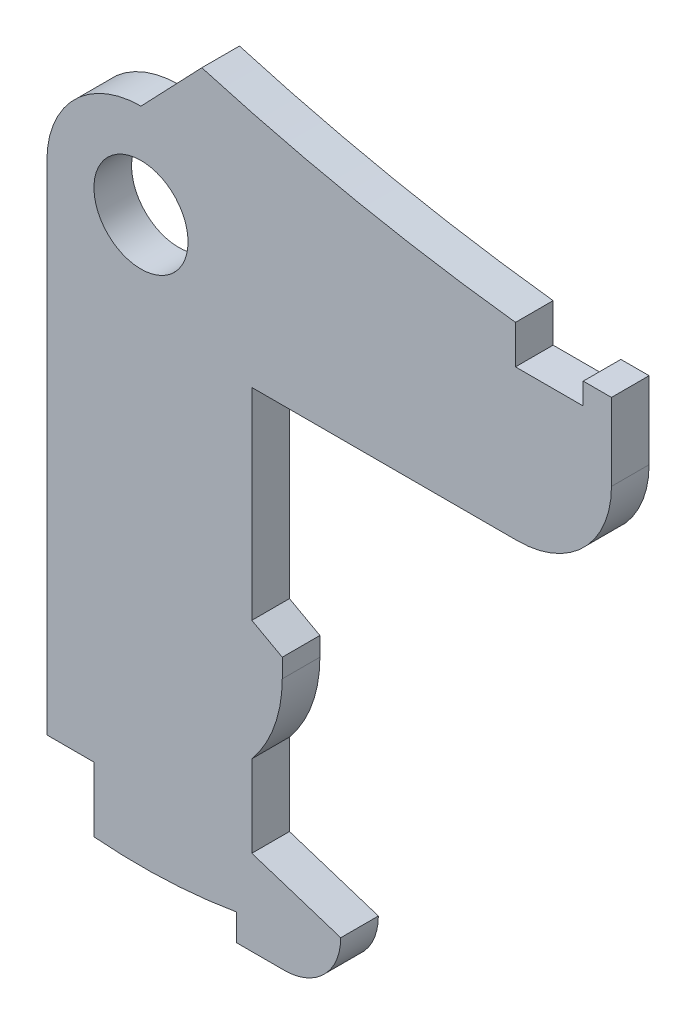
ISO-10303-21;
HEADER;
FILE_DESCRIPTION(('STEP AP214'),'2;1');
FILE_NAME('part.step','',(''),(''),'','','');
FILE_SCHEMA(('AUTOMOTIVE_DESIGN { 1 0 10303 214 1 1 1 1 }'));
ENDSEC;
DATA;
#1=APPLICATION_CONTEXT('core data for automotive mechanical design processes');
#2=APPLICATION_PROTOCOL_DEFINITION('international standard','automotive_design',2000,#1);
#3=PRODUCT_CONTEXT('',#1,'mechanical');
#4=PRODUCT('Part','Part','',(#3));
#5=PRODUCT_RELATED_PRODUCT_CATEGORY('part','',(#4));
#6=PRODUCT_DEFINITION_FORMATION('','',#4);
#7=PRODUCT_DEFINITION_CONTEXT('part definition',#1,'design');
#8=PRODUCT_DEFINITION('design','',#6,#7);
#9=PRODUCT_DEFINITION_SHAPE('','',#8);
#10=(LENGTH_UNIT() NAMED_UNIT(*) SI_UNIT(.MILLI.,.METRE.));
#11=(NAMED_UNIT(*) PLANE_ANGLE_UNIT() SI_UNIT($,.RADIAN.));
#12=(NAMED_UNIT(*) SI_UNIT($,.STERADIAN.) SOLID_ANGLE_UNIT());
#13=UNCERTAINTY_MEASURE_WITH_UNIT(LENGTH_MEASURE(1.E-05),#10,'distance_accuracy_value','');
#14=(GEOMETRIC_REPRESENTATION_CONTEXT(3) GLOBAL_UNCERTAINTY_ASSIGNED_CONTEXT((#13)) GLOBAL_UNIT_ASSIGNED_CONTEXT((#10,
#11,#12)) REPRESENTATION_CONTEXT('',''));
#15=CARTESIAN_POINT('',(0.,0.,0.));
#16=DIRECTION('',(0.,0.,1.));
#17=DIRECTION('',(1.,0.,0.));
#18=AXIS2_PLACEMENT_3D('',#15,#16,#17);
#19=CARTESIAN_POINT('',(0.,-69.1109493092821,2.));
#20=DIRECTION('',(0.,1.,0.));
#21=DIRECTION('',(0.,0.,1.));
#22=AXIS2_PLACEMENT_3D('',#19,#20,#21);
#23=PLANE('',#22);
#24=DIRECTION('',(1.,0.,0.));
#25=VECTOR('',#24,1.);
#26=CARTESIAN_POINT('',(0.,-69.1109493092821,0.));
#27=LINE('',#26,#25);
#28=CARTESIAN_POINT('',(58.5628566486414,-69.1109493092821,0.));
#29=VERTEX_POINT('',#28);
#30=CARTESIAN_POINT('',(61.1004317090133,-69.1109493092821,0.));
#31=VERTEX_POINT('',#30);
#32=EDGE_CURVE('E226',#29,#31,#27,.T.);
#33=ORIENTED_EDGE('',*,*,#32,.T.);
#34=DIRECTION('',(0.,0.,-1.));
#35=VECTOR('',#34,1.);
#36=CARTESIAN_POINT('',(61.1004317090133,-69.1109493092821,2.));
#37=LINE('',#36,#35);
#38=CARTESIAN_POINT('',(61.1004317090133,-69.1109493092821,2.));
#39=VERTEX_POINT('',#38);
#40=EDGE_CURVE('E11',#39,#31,#37,.T.);
#41=ORIENTED_EDGE('',*,*,#40,.F.);
#42=DIRECTION('',(1.,0.,0.));
#43=VECTOR('',#42,1.);
#44=CARTESIAN_POINT('',(0.,-69.1109493092821,2.));
#45=LINE('',#44,#43);
#46=CARTESIAN_POINT('',(58.5628566486414,-69.1109493092821,2.));
#47=VERTEX_POINT('',#46);
#48=EDGE_CURVE('E398',#47,#39,#45,.T.);
#49=ORIENTED_EDGE('',*,*,#48,.F.);
#50=DIRECTION('',(0.,0.,-1.));
#51=VECTOR('',#50,1.);
#52=CARTESIAN_POINT('',(58.5628566486414,-69.1109493092821,2.));
#53=LINE('',#52,#51);
#54=EDGE_CURVE('E222',#47,#29,#53,.T.);
#55=ORIENTED_EDGE('',*,*,#54,.T.);
#56=EDGE_LOOP('',(#33,#41,#49,#55));
#57=FACE_BOUND('',#56,.T.);
#58=ADVANCED_FACE('F34',(#57),#23,.F.);
#59=CARTESIAN_POINT('',(61.1004317090133,-66.1109493092821,2.));
#60=DIRECTION('',(0.,0.,-1.));
#61=DIRECTION('',(-1.,0.,0.));
#62=AXIS2_PLACEMENT_3D('',#59,#60,#61);
#63=CYLINDRICAL_SURFACE('',#62,3.00000000000001);
#64=CARTESIAN_POINT('',(61.1004317090133,-66.1109493092821,0.));
#65=DIRECTION('',(0.,0.,1.));
#66=DIRECTION('',(1.,0.,0.));
#67=AXIS2_PLACEMENT_3D('',#64,#65,#66);
#68=CIRCLE('',#67,3.00000000000001);
#69=CARTESIAN_POINT('',(64.1004317090133,-66.1109493092821,0.));
#70=VERTEX_POINT('',#69);
#71=EDGE_CURVE('E229',#31,#70,#68,.T.);
#72=ORIENTED_EDGE('',*,*,#71,.T.);
#73=DIRECTION('',(0.,0.,-1.));
#74=VECTOR('',#73,1.);
#75=CARTESIAN_POINT('',(64.1004317090133,-66.1109493092821,2.));
#76=LINE('',#75,#74);
#77=CARTESIAN_POINT('',(64.1004317090133,-66.1109493092821,2.));
#78=VERTEX_POINT('',#77);
#79=EDGE_CURVE('E43',#78,#70,#76,.T.);
#80=ORIENTED_EDGE('',*,*,#79,.F.);
#81=CARTESIAN_POINT('',(61.1004317090133,-66.1109493092821,2.));
#82=DIRECTION('',(0.,0.,1.));
#83=DIRECTION('',(1.,0.,0.));
#84=AXIS2_PLACEMENT_3D('',#81,#82,#83);
#85=CIRCLE('',#84,3.00000000000001);
#86=EDGE_CURVE('E138',#39,#78,#85,.T.);
#87=ORIENTED_EDGE('',*,*,#86,.F.);
#88=ORIENTED_EDGE('',*,*,#40,.T.);
#89=EDGE_LOOP('',(#72,#80,#87,#88));
#90=FACE_BOUND('',#89,.T.);
#91=ADVANCED_FACE('F412',(#90),#63,.T.);
#92=CARTESIAN_POINT('',(-13.2752413972475,-41.1476724947514,2.));
#93=DIRECTION('',(-0.307040459564451,-0.951696462213899,0.));
#94=DIRECTION('',(0.951696462213899,-0.307040459564451,0.));
#95=AXIS2_PLACEMENT_3D('',#92,#93,#94);
#96=PLANE('',#95);
#97=DIRECTION('',(-0.951696462213899,0.307040459564451,0.));
#98=VECTOR('',#97,1.);
#99=CARTESIAN_POINT('',(-13.2752413972475,-41.1476724947514,0.));
#100=LINE('',#99,#98);
#101=CARTESIAN_POINT('',(59.3761202637687,-64.5867713650885,0.));
#102=VERTEX_POINT('',#101);
#103=EDGE_CURVE('E231',#70,#102,#100,.T.);
#104=ORIENTED_EDGE('',*,*,#103,.T.);
#105=DIRECTION('',(0.,0.,-1.));
#106=VECTOR('',#105,1.);
#107=CARTESIAN_POINT('',(59.3761202637687,-64.5867713650885,2.));
#108=LINE('',#107,#106);
#109=CARTESIAN_POINT('',(59.3761202637687,-64.5867713650885,2.));
#110=VERTEX_POINT('',#109);
#111=EDGE_CURVE('E324',#110,#102,#108,.T.);
#112=ORIENTED_EDGE('',*,*,#111,.F.);
#113=DIRECTION('',(-0.951696462213899,0.307040459564451,0.));
#114=VECTOR('',#113,1.);
#115=CARTESIAN_POINT('',(-13.2752413972475,-41.1476724947514,2.));
#116=LINE('',#115,#114);
#117=EDGE_CURVE('E331',#78,#110,#116,.T.);
#118=ORIENTED_EDGE('',*,*,#117,.F.);
#119=ORIENTED_EDGE('',*,*,#79,.T.);
#120=EDGE_LOOP('',(#104,#112,#118,#119));
#121=FACE_BOUND('',#120,.T.);
#122=ADVANCED_FACE('F329',(#121),#96,.F.);
#123=CARTESIAN_POINT('',(59.3761202637687,0.,2.));
#124=DIRECTION('',(1.,0.,0.));
#125=DIRECTION('',(0.,0.,-1.));
#126=AXIS2_PLACEMENT_3D('',#123,#124,#125);
#127=PLANE('',#126);
#128=DIRECTION('',(0.,-1.,0.));
#129=VECTOR('',#128,1.);
#130=CARTESIAN_POINT('',(59.3761202637687,0.,0.));
#131=LINE('',#130,#129);
#132=CARTESIAN_POINT('',(59.3761202637687,-60.2400285328767,0.));
#133=VERTEX_POINT('',#132);
#134=EDGE_CURVE('E234',#133,#102,#131,.T.);
#135=ORIENTED_EDGE('',*,*,#134,.F.);
#136=DIRECTION('',(0.,0.,-1.));
#137=VECTOR('',#136,1.);
#138=CARTESIAN_POINT('',(59.3761202637687,-60.2400285328767,2.));
#139=LINE('',#138,#137);
#140=CARTESIAN_POINT('',(59.3761202637687,-60.2400285328767,2.));
#141=VERTEX_POINT('',#140);
#142=EDGE_CURVE('E322',#141,#133,#139,.T.);
#143=ORIENTED_EDGE('',*,*,#142,.F.);
#144=DIRECTION('',(0.,-1.,0.));
#145=VECTOR('',#144,1.);
#146=CARTESIAN_POINT('',(59.3761202637687,0.,2.));
#147=LINE('',#146,#145);
#148=EDGE_CURVE('E342',#141,#110,#147,.T.);
#149=ORIENTED_EDGE('',*,*,#148,.T.);
#150=ORIENTED_EDGE('',*,*,#111,.T.);
#151=EDGE_LOOP('',(#135,#143,#149,#150));
#152=FACE_BOUND('',#151,.T.);
#153=ADVANCED_FACE('F339',(#152),#127,.T.);
#154=CARTESIAN_POINT('',(53.95842090491,-55.7530720627505,2.));
#155=DIRECTION('',(0.,0.,-1.));
#156=DIRECTION('',(-1.,0.,0.));
#157=AXIS2_PLACEMENT_3D('',#154,#155,#156);
#158=CYLINDRICAL_SURFACE('',#157,7.03450387076339);
#159=CARTESIAN_POINT('',(53.95842090491,-55.7530720627505,0.));
#160=DIRECTION('',(0.,0.,1.));
#161=DIRECTION('',(1.,0.,0.));
#162=AXIS2_PLACEMENT_3D('',#159,#160,#161);
#163=CIRCLE('',#162,7.03450387076339);
#164=CARTESIAN_POINT('',(60.9929247756734,-55.7530720627505,0.));
#165=VERTEX_POINT('',#164);
#166=EDGE_CURVE('E237',#165,#133,#163,.F.);
#167=ORIENTED_EDGE('',*,*,#166,.F.);
#168=DIRECTION('',(0.,0.,-1.));
#169=VECTOR('',#168,1.);
#170=CARTESIAN_POINT('',(60.9929247756734,-55.7530720627505,2.));
#171=LINE('',#170,#169);
#172=CARTESIAN_POINT('',(60.9929247756734,-55.7530720627505,2.));
#173=VERTEX_POINT('',#172);
#174=EDGE_CURVE('E320',#173,#165,#171,.T.);
#175=ORIENTED_EDGE('',*,*,#174,.F.);
#176=CARTESIAN_POINT('',(53.95842090491,-55.7530720627505,2.));
#177=DIRECTION('',(0.,0.,1.));
#178=DIRECTION('',(1.,0.,0.));
#179=AXIS2_PLACEMENT_3D('',#176,#177,#178);
#180=CIRCLE('',#179,7.03450387076339);
#181=EDGE_CURVE('E345',#173,#141,#180,.F.);
#182=ORIENTED_EDGE('',*,*,#181,.T.);
#183=ORIENTED_EDGE('',*,*,#142,.T.);
#184=EDGE_LOOP('',(#167,#175,#182,#183));
#185=FACE_BOUND('',#184,.T.);
#186=ADVANCED_FACE('F422',(#185),#158,.T.);
#187=CARTESIAN_POINT('',(60.9929247756734,0.,2.));
#188=DIRECTION('',(-1.,0.,0.));
#189=DIRECTION('',(0.,0.,1.));
#190=AXIS2_PLACEMENT_3D('',#187,#188,#189);
#191=PLANE('',#190);
#192=DIRECTION('',(0.,1.,0.));
#193=VECTOR('',#192,1.);
#194=CARTESIAN_POINT('',(60.9929247756734,0.,0.));
#195=LINE('',#194,#193);
#196=CARTESIAN_POINT('',(60.9929247756734,-54.7553142853299,0.));
#197=VERTEX_POINT('',#196);
#198=EDGE_CURVE('E240',#165,#197,#195,.T.);
#199=ORIENTED_EDGE('',*,*,#198,.T.);
#200=DIRECTION('',(0.,0.,-1.));
#201=VECTOR('',#200,1.);
#202=CARTESIAN_POINT('',(60.9929247756734,-54.7553142853299,2.));
#203=LINE('',#202,#201);
#204=CARTESIAN_POINT('',(60.9929247756734,-54.7553142853299,2.));
#205=VERTEX_POINT('',#204);
#206=EDGE_CURVE('E317',#205,#197,#203,.T.);
#207=ORIENTED_EDGE('',*,*,#206,.F.);
#208=DIRECTION('',(0.,1.,0.));
#209=VECTOR('',#208,1.);
#210=CARTESIAN_POINT('',(60.9929247756734,0.,2.));
#211=LINE('',#210,#209);
#212=EDGE_CURVE('E347',#173,#205,#211,.T.);
#213=ORIENTED_EDGE('',*,*,#212,.F.);
#214=ORIENTED_EDGE('',*,*,#174,.T.);
#215=EDGE_LOOP('',(#199,#207,#213,#214));
#216=FACE_BOUND('',#215,.T.);
#217=ADVANCED_FACE('F425',(#216),#191,.F.);
#218=CARTESIAN_POINT('',(-8.97597044556049,-16.3550723728844,2.));
#219=DIRECTION('',(-0.481123509234274,-0.876652821168162,0.));
#220=DIRECTION('',(0.876652821168162,-0.481123509234274,0.));
#221=AXIS2_PLACEMENT_3D('',#218,#219,#220);
#222=PLANE('',#221);
#223=DIRECTION('',(-0.876652821168162,0.481123509234274,0.));
#224=VECTOR('',#223,1.);
#225=CARTESIAN_POINT('',(-8.97597044556049,-16.3550723728844,0.));
#226=LINE('',#225,#224);
#227=CARTESIAN_POINT('',(59.3761202637687,-53.8679816472202,0.));
#228=VERTEX_POINT('',#227);
#229=EDGE_CURVE('E242',#197,#228,#226,.T.);
#230=ORIENTED_EDGE('',*,*,#229,.T.);
#231=DIRECTION('',(0.,0.,-1.));
#232=VECTOR('',#231,1.);
#233=CARTESIAN_POINT('',(59.3761202637687,-53.8679816472202,2.));
#234=LINE('',#233,#232);
#235=CARTESIAN_POINT('',(59.3761202637687,-53.8679816472202,2.));
#236=VERTEX_POINT('',#235);
#237=EDGE_CURVE('E315',#236,#228,#234,.T.);
#238=ORIENTED_EDGE('',*,*,#237,.F.);
#239=DIRECTION('',(-0.876652821168162,0.481123509234274,0.));
#240=VECTOR('',#239,1.);
#241=CARTESIAN_POINT('',(-8.97597044556049,-16.3550723728844,2.));
#242=LINE('',#241,#240);
#243=EDGE_CURVE('E353',#205,#236,#242,.T.);
#244=ORIENTED_EDGE('',*,*,#243,.F.);
#245=ORIENTED_EDGE('',*,*,#206,.T.);
#246=EDGE_LOOP('',(#230,#238,#244,#245));
#247=FACE_BOUND('',#246,.T.);
#248=ADVANCED_FACE('F429',(#247),#222,.F.);
#249=CARTESIAN_POINT('',(59.3761202637687,0.,2.));
#250=DIRECTION('',(1.,0.,0.));
#251=DIRECTION('',(0.,0.,-1.));
#252=AXIS2_PLACEMENT_3D('',#249,#250,#251);
#253=PLANE('',#252);
#254=DIRECTION('',(0.,-1.,0.));
#255=VECTOR('',#254,1.);
#256=CARTESIAN_POINT('',(59.3761202637687,0.,0.));
#257=LINE('',#256,#255);
#258=CARTESIAN_POINT('',(59.3761202637687,-43.149191929352,0.));
#259=VERTEX_POINT('',#258);
#260=EDGE_CURVE('E245',#259,#228,#257,.T.);
#261=ORIENTED_EDGE('',*,*,#260,.F.);
#262=DIRECTION('',(0.,0.,-1.));
#263=VECTOR('',#262,1.);
#264=CARTESIAN_POINT('',(59.3761202637687,-43.149191929352,2.));
#265=LINE('',#264,#263);
#266=CARTESIAN_POINT('',(59.3761202637687,-43.149191929352,2.));
#267=VERTEX_POINT('',#266);
#268=EDGE_CURVE('E313',#267,#259,#265,.T.);
#269=ORIENTED_EDGE('',*,*,#268,.F.);
#270=DIRECTION('',(0.,-1.,0.));
#271=VECTOR('',#270,1.);
#272=CARTESIAN_POINT('',(59.3761202637687,0.,2.));
#273=LINE('',#272,#271);
#274=EDGE_CURVE('E355',#267,#236,#273,.T.);
#275=ORIENTED_EDGE('',*,*,#274,.T.);
#276=ORIENTED_EDGE('',*,*,#237,.T.);
#277=EDGE_LOOP('',(#261,#269,#275,#276));
#278=FACE_BOUND('',#277,.T.);
#279=ADVANCED_FACE('F433',(#278),#253,.T.);
#280=CARTESIAN_POINT('',(0.,-43.149191929352,2.));
#281=DIRECTION('',(0.,-1.,0.));
#282=DIRECTION('',(0.,0.,-1.));
#283=AXIS2_PLACEMENT_3D('',#280,#281,#282);
#284=PLANE('',#283);
#285=DIRECTION('',(-1.,0.,0.));
#286=VECTOR('',#285,1.);
#287=CARTESIAN_POINT('',(0.,-43.149191929352,0.));
#288=LINE('',#287,#286);
#289=CARTESIAN_POINT('',(73.4867153231227,-43.149191929352,0.));
#290=VERTEX_POINT('',#289);
#291=EDGE_CURVE('E248',#290,#259,#288,.T.);
#292=ORIENTED_EDGE('',*,*,#291,.F.);
#293=DIRECTION('',(0.,0.,-1.));
#294=VECTOR('',#293,1.);
#295=CARTESIAN_POINT('',(73.4867153231227,-43.149191929352,2.));
#296=LINE('',#295,#294);
#297=CARTESIAN_POINT('',(73.4867153231227,-43.149191929352,2.));
#298=VERTEX_POINT('',#297);
#299=EDGE_CURVE('E311',#298,#290,#296,.T.);
#300=ORIENTED_EDGE('',*,*,#299,.F.);
#301=DIRECTION('',(-1.,0.,0.));
#302=VECTOR('',#301,1.);
#303=CARTESIAN_POINT('',(0.,-43.149191929352,2.));
#304=LINE('',#303,#302);
#305=EDGE_CURVE('E358',#298,#267,#304,.T.);
#306=ORIENTED_EDGE('',*,*,#305,.T.);
#307=ORIENTED_EDGE('',*,*,#268,.T.);
#308=EDGE_LOOP('',(#292,#300,#306,#307));
#309=FACE_BOUND('',#308,.T.);
#310=ADVANCED_FACE('F437',(#309),#284,.T.);
#311=CARTESIAN_POINT('',(73.4867153231227,-38.149191929352,2.));
#312=DIRECTION('',(0.,0.,-1.));
#313=DIRECTION('',(-1.,0.,0.));
#314=AXIS2_PLACEMENT_3D('',#311,#312,#313);
#315=CYLINDRICAL_SURFACE('',#314,5.);
#316=CARTESIAN_POINT('',(73.4867153231227,-38.149191929352,0.));
#317=DIRECTION('',(0.,0.,1.));
#318=DIRECTION('',(1.,0.,0.));
#319=AXIS2_PLACEMENT_3D('',#316,#317,#318);
#320=CIRCLE('',#319,5.);
#321=CARTESIAN_POINT('',(78.4867153231227,-38.149191929352,0.));
#322=VERTEX_POINT('',#321);
#323=EDGE_CURVE('E251',#322,#290,#320,.F.);
#324=ORIENTED_EDGE('',*,*,#323,.F.);
#325=DIRECTION('',(0.,0.,-1.));
#326=VECTOR('',#325,1.);
#327=CARTESIAN_POINT('',(78.4867153231227,-38.149191929352,2.));
#328=LINE('',#327,#326);
#329=CARTESIAN_POINT('',(78.4867153231227,-38.149191929352,2.));
#330=VERTEX_POINT('',#329);
#331=EDGE_CURVE('E309',#330,#322,#328,.T.);
#332=ORIENTED_EDGE('',*,*,#331,.F.);
#333=CARTESIAN_POINT('',(73.4867153231227,-38.149191929352,2.));
#334=DIRECTION('',(0.,0.,1.));
#335=DIRECTION('',(1.,0.,0.));
#336=AXIS2_PLACEMENT_3D('',#333,#334,#335);
#337=CIRCLE('',#336,5.);
#338=EDGE_CURVE('E361',#330,#298,#337,.F.);
#339=ORIENTED_EDGE('',*,*,#338,.T.);
#340=ORIENTED_EDGE('',*,*,#299,.T.);
#341=EDGE_LOOP('',(#324,#332,#339,#340));
#342=FACE_BOUND('',#341,.T.);
#343=ADVANCED_FACE('F441',(#342),#315,.T.);
#344=CARTESIAN_POINT('',(78.4867153231227,0.,2.));
#345=DIRECTION('',(1.,0.,0.));
#346=DIRECTION('',(0.,0.,-1.));
#347=AXIS2_PLACEMENT_3D('',#344,#345,#346);
#348=PLANE('',#347);
#349=DIRECTION('',(0.,-1.,0.));
#350=VECTOR('',#349,1.);
#351=CARTESIAN_POINT('',(78.4867153231227,0.,0.));
#352=LINE('',#351,#350);
#353=CARTESIAN_POINT('',(78.4867153231227,-34.0532753395048,0.));
#354=VERTEX_POINT('',#353);
#355=EDGE_CURVE('E254',#354,#322,#352,.T.);
#356=ORIENTED_EDGE('',*,*,#355,.F.);
#357=DIRECTION('',(0.,0.,-1.));
#358=VECTOR('',#357,1.);
#359=CARTESIAN_POINT('',(78.4867153231227,-34.0532753395048,2.));
#360=LINE('',#359,#358);
#361=CARTESIAN_POINT('',(78.4867153231227,-34.0532753395048,2.));
#362=VERTEX_POINT('',#361);
#363=EDGE_CURVE('E307',#362,#354,#360,.T.);
#364=ORIENTED_EDGE('',*,*,#363,.F.);
#365=DIRECTION('',(0.,-1.,0.));
#366=VECTOR('',#365,1.);
#367=CARTESIAN_POINT('',(78.4867153231227,0.,2.));
#368=LINE('',#367,#366);
#369=EDGE_CURVE('E364',#362,#330,#368,.T.);
#370=ORIENTED_EDGE('',*,*,#369,.T.);
#371=ORIENTED_EDGE('',*,*,#331,.T.);
#372=EDGE_LOOP('',(#356,#364,#370,#371));
#373=FACE_BOUND('',#372,.T.);
#374=ADVANCED_FACE('F445',(#373),#348,.T.);
#375=CARTESIAN_POINT('',(0.,-34.0532753395048,2.));
#376=DIRECTION('',(0.,1.,0.));
#377=DIRECTION('',(0.,0.,1.));
#378=AXIS2_PLACEMENT_3D('',#375,#376,#377);
#379=PLANE('',#378);
#380=DIRECTION('',(1.,0.,0.));
#381=VECTOR('',#380,1.);
#382=CARTESIAN_POINT('',(0.,-34.0532753395048,0.));
#383=LINE('',#382,#381);
#384=CARTESIAN_POINT('',(76.9867153231227,-34.0532753395048,0.));
#385=VERTEX_POINT('',#384);
#386=EDGE_CURVE('E257',#385,#354,#383,.T.);
#387=ORIENTED_EDGE('',*,*,#386,.F.);
#388=DIRECTION('',(0.,0.,-1.));
#389=VECTOR('',#388,1.);
#390=CARTESIAN_POINT('',(76.9867153231227,-34.0532753395048,2.));
#391=LINE('',#390,#389);
#392=CARTESIAN_POINT('',(76.9867153231227,-34.0532753395048,2.));
#393=VERTEX_POINT('',#392);
#394=EDGE_CURVE('E305',#393,#385,#391,.T.);
#395=ORIENTED_EDGE('',*,*,#394,.F.);
#396=DIRECTION('',(1.,0.,0.));
#397=VECTOR('',#396,1.);
#398=CARTESIAN_POINT('',(0.,-34.0532753395048,2.));
#399=LINE('',#398,#397);
#400=EDGE_CURVE('E367',#393,#362,#399,.T.);
#401=ORIENTED_EDGE('',*,*,#400,.T.);
#402=ORIENTED_EDGE('',*,*,#363,.T.);
#403=EDGE_LOOP('',(#387,#395,#401,#402));
#404=FACE_BOUND('',#403,.T.);
#405=ADVANCED_FACE('F449',(#404),#379,.T.);
#406=CARTESIAN_POINT('',(76.9867153231227,0.,2.));
#407=DIRECTION('',(-1.,0.,0.));
#408=DIRECTION('',(0.,0.,1.));
#409=AXIS2_PLACEMENT_3D('',#406,#407,#408);
#410=PLANE('',#409);
#411=DIRECTION('',(0.,1.,0.));
#412=VECTOR('',#411,1.);
#413=CARTESIAN_POINT('',(76.9867153231227,0.,0.));
#414=LINE('',#413,#412);
#415=CARTESIAN_POINT('',(76.9867153231227,-35.1984634641797,0.));
#416=VERTEX_POINT('',#415);
#417=EDGE_CURVE('E260',#416,#385,#414,.T.);
#418=ORIENTED_EDGE('',*,*,#417,.F.);
#419=DIRECTION('',(0.,0.,-1.));
#420=VECTOR('',#419,1.);
#421=CARTESIAN_POINT('',(76.9867153231227,-35.1984634641797,2.));
#422=LINE('',#421,#420);
#423=CARTESIAN_POINT('',(76.9867153231227,-35.1984634641797,2.));
#424=VERTEX_POINT('',#423);
#425=EDGE_CURVE('E303',#424,#416,#422,.T.);
#426=ORIENTED_EDGE('',*,*,#425,.F.);
#427=DIRECTION('',(0.,1.,0.));
#428=VECTOR('',#427,1.);
#429=CARTESIAN_POINT('',(76.9867153231227,0.,2.));
#430=LINE('',#429,#428);
#431=EDGE_CURVE('E370',#424,#393,#430,.T.);
#432=ORIENTED_EDGE('',*,*,#431,.T.);
#433=ORIENTED_EDGE('',*,*,#394,.T.);
#434=EDGE_LOOP('',(#418,#426,#432,#433));
#435=FACE_BOUND('',#434,.T.);
#436=ADVANCED_FACE('F453',(#435),#410,.T.);
#437=CARTESIAN_POINT('',(0.,-35.1984634641797,2.));
#438=DIRECTION('',(0.,1.,0.));
#439=DIRECTION('',(0.,0.,1.));
#440=AXIS2_PLACEMENT_3D('',#437,#438,#439);
#441=PLANE('',#440);
#442=DIRECTION('',(1.,0.,0.));
#443=VECTOR('',#442,1.);
#444=CARTESIAN_POINT('',(0.,-35.1984634641797,0.));
#445=LINE('',#444,#443);
#446=CARTESIAN_POINT('',(73.3867153231227,-35.1984634641797,0.));
#447=VERTEX_POINT('',#446);
#448=EDGE_CURVE('E263',#447,#416,#445,.T.);
#449=ORIENTED_EDGE('',*,*,#448,.F.);
#450=DIRECTION('',(0.,0.,-1.));
#451=VECTOR('',#450,1.);
#452=CARTESIAN_POINT('',(73.3867153231227,-35.1984634641797,2.));
#453=LINE('',#452,#451);
#454=CARTESIAN_POINT('',(73.3867153231227,-35.1984634641797,2.));
#455=VERTEX_POINT('',#454);
#456=EDGE_CURVE('E301',#455,#447,#453,.T.);
#457=ORIENTED_EDGE('',*,*,#456,.F.);
#458=DIRECTION('',(1.,0.,0.));
#459=VECTOR('',#458,1.);
#460=CARTESIAN_POINT('',(0.,-35.1984634641797,2.));
#461=LINE('',#460,#459);
#462=EDGE_CURVE('E373',#455,#424,#461,.T.);
#463=ORIENTED_EDGE('',*,*,#462,.T.);
#464=ORIENTED_EDGE('',*,*,#425,.T.);
#465=EDGE_LOOP('',(#449,#457,#463,#464));
#466=FACE_BOUND('',#465,.T.);
#467=ADVANCED_FACE('F457',(#466),#441,.T.);
#468=CARTESIAN_POINT('',(73.3867153231227,0.,2.));
#469=DIRECTION('',(1.,0.,0.));
#470=DIRECTION('',(0.,0.,-1.));
#471=AXIS2_PLACEMENT_3D('',#468,#469,#470);
#472=PLANE('',#471);
#473=DIRECTION('',(0.,-1.,0.));
#474=VECTOR('',#473,1.);
#475=CARTESIAN_POINT('',(73.3867153231227,0.,0.));
#476=LINE('',#475,#474);
#477=CARTESIAN_POINT('',(73.3867153231227,-33.149191929352,0.));
#478=VERTEX_POINT('',#477);
#479=EDGE_CURVE('E266',#478,#447,#476,.T.);
#480=ORIENTED_EDGE('',*,*,#479,.F.);
#481=DIRECTION('',(0.,0.,-1.));
#482=VECTOR('',#481,1.);
#483=CARTESIAN_POINT('',(73.3867153231227,-33.149191929352,2.));
#484=LINE('',#483,#482);
#485=CARTESIAN_POINT('',(73.3867153231227,-33.149191929352,2.));
#486=VERTEX_POINT('',#485);
#487=EDGE_CURVE('E299',#486,#478,#484,.T.);
#488=ORIENTED_EDGE('',*,*,#487,.F.);
#489=DIRECTION('',(0.,-1.,0.));
#490=VECTOR('',#489,1.);
#491=CARTESIAN_POINT('',(73.3867153231227,0.,2.));
#492=LINE('',#491,#490);
#493=EDGE_CURVE('E376',#486,#455,#492,.T.);
#494=ORIENTED_EDGE('',*,*,#493,.T.);
#495=ORIENTED_EDGE('',*,*,#456,.T.);
#496=EDGE_LOOP('',(#480,#488,#494,#495));
#497=FACE_BOUND('',#496,.T.);
#498=ADVANCED_FACE('F461',(#497),#472,.T.);
#499=CARTESIAN_POINT('',(85.520841075924,69.3810826330756,2.));
#500=DIRECTION('',(0.,0.,-1.));
#501=DIRECTION('',(-1.,0.,0.));
#502=AXIS2_PLACEMENT_3D('',#499,#500,#501);
#503=CYLINDRICAL_SURFACE('',#502,103.245795118405);
#504=CARTESIAN_POINT('',(85.520841075924,69.3810826330756,0.));
#505=DIRECTION('',(0.,0.,1.));
#506=DIRECTION('',(1.,0.,0.));
#507=AXIS2_PLACEMENT_3D('',#504,#505,#506);
#508=CIRCLE('',#507,103.245795118405);
#509=CARTESIAN_POINT('',(56.718627508621,-29.7659127992372,0.));
#510=VERTEX_POINT('',#509);
#511=EDGE_CURVE('E269',#478,#510,#508,.F.);
#512=ORIENTED_EDGE('',*,*,#511,.T.);
#513=DIRECTION('',(0.,0.,-1.));
#514=VECTOR('',#513,1.);
#515=CARTESIAN_POINT('',(56.718627508621,-29.7659127992372,2.));
#516=LINE('',#515,#514);
#517=CARTESIAN_POINT('',(56.718627508621,-29.7659127992372,2.));
#518=VERTEX_POINT('',#517);
#519=EDGE_CURVE('E297',#518,#510,#516,.T.);
#520=ORIENTED_EDGE('',*,*,#519,.F.);
#521=CARTESIAN_POINT('',(85.520841075924,69.3810826330756,2.));
#522=DIRECTION('',(0.,0.,1.));
#523=DIRECTION('',(1.,0.,0.));
#524=AXIS2_PLACEMENT_3D('',#521,#522,#523);
#525=CIRCLE('',#524,103.245795118405);
#526=EDGE_CURVE('E379',#486,#518,#525,.F.);
#527=ORIENTED_EDGE('',*,*,#526,.F.);
#528=ORIENTED_EDGE('',*,*,#487,.T.);
#529=EDGE_LOOP('',(#512,#520,#527,#528));
#530=FACE_BOUND('',#529,.T.);
#531=ADVANCED_FACE('F465',(#530),#503,.F.);
#532=CARTESIAN_POINT('',(44.5238341929609,-42.5318505329619,2.));
#533=DIRECTION('',(-0.723097327047915,0.690746158596745,0.));
#534=DIRECTION('',(-0.690746158596745,-0.723097327047916,0.));
#535=AXIS2_PLACEMENT_3D('',#532,#533,#534);
#536=PLANE('',#535);
#537=DIRECTION('',(0.690746158596745,0.723097327047916,0.));
#538=VECTOR('',#537,1.);
#539=CARTESIAN_POINT('',(44.5238341929609,-42.5318505329619,0.));
#540=LINE('',#539,#538);
#541=CARTESIAN_POINT('',(53.4867153231227,-33.149191929352,0.));
#542=VERTEX_POINT('',#541);
#543=EDGE_CURVE('E272',#542,#510,#540,.T.);
#544=ORIENTED_EDGE('',*,*,#543,.F.);
#545=DIRECTION('',(0.,0.,-1.));
#546=VECTOR('',#545,1.);
#547=CARTESIAN_POINT('',(53.4867153231227,-33.149191929352,2.));
#548=LINE('',#547,#546);
#549=CARTESIAN_POINT('',(53.4867153231227,-33.149191929352,2.));
#550=VERTEX_POINT('',#549);
#551=EDGE_CURVE('E295',#550,#542,#548,.T.);
#552=ORIENTED_EDGE('',*,*,#551,.F.);
#553=DIRECTION('',(0.690746158596745,0.723097327047916,0.));
#554=VECTOR('',#553,1.);
#555=CARTESIAN_POINT('',(44.5238341929609,-42.5318505329619,2.));
#556=LINE('',#555,#554);
#557=EDGE_CURVE('E381',#550,#518,#556,.T.);
#558=ORIENTED_EDGE('',*,*,#557,.T.);
#559=ORIENTED_EDGE('',*,*,#519,.T.);
#560=EDGE_LOOP('',(#544,#552,#558,#559));
#561=FACE_BOUND('',#560,.T.);
#562=ADVANCED_FACE('F469',(#561),#536,.T.);
#563=CARTESIAN_POINT('',(53.4867153231227,-38.149191929352,2.));
#564=DIRECTION('',(0.,0.,-1.));
#565=DIRECTION('',(-1.,0.,0.));
#566=AXIS2_PLACEMENT_3D('',#563,#564,#565);
#567=CYLINDRICAL_SURFACE('',#566,5.);
#568=CARTESIAN_POINT('',(53.4867153231227,-38.149191929352,0.));
#569=DIRECTION('',(0.,0.,1.));
#570=DIRECTION('',(1.,0.,0.));
#571=AXIS2_PLACEMENT_3D('',#568,#569,#570);
#572=CIRCLE('',#571,5.);
#573=CARTESIAN_POINT('',(48.4867153231227,-38.149191929352,0.));
#574=VERTEX_POINT('',#573);
#575=EDGE_CURVE('E275',#542,#574,#572,.T.);
#576=ORIENTED_EDGE('',*,*,#575,.T.);
#577=DIRECTION('',(0.,0.,-1.));
#578=VECTOR('',#577,1.);
#579=CARTESIAN_POINT('',(48.4867153231227,-38.149191929352,2.));
#580=LINE('',#579,#578);
#581=CARTESIAN_POINT('',(48.4867153231227,-38.149191929352,2.));
#582=VERTEX_POINT('',#581);
#583=EDGE_CURVE('E293',#582,#574,#580,.T.);
#584=ORIENTED_EDGE('',*,*,#583,.F.);
#585=CARTESIAN_POINT('',(53.4867153231227,-38.149191929352,2.));
#586=DIRECTION('',(0.,0.,1.));
#587=DIRECTION('',(1.,0.,0.));
#588=AXIS2_PLACEMENT_3D('',#585,#586,#587);
#589=CIRCLE('',#588,5.);
#590=EDGE_CURVE('E384',#550,#582,#589,.T.);
#591=ORIENTED_EDGE('',*,*,#590,.F.);
#592=ORIENTED_EDGE('',*,*,#551,.T.);
#593=EDGE_LOOP('',(#576,#584,#591,#592));
#594=FACE_BOUND('',#593,.T.);
#595=ADVANCED_FACE('F473',(#594),#567,.T.);
#596=CARTESIAN_POINT('',(48.4867153231227,0.,2.));
#597=DIRECTION('',(-1.,0.,0.));
#598=DIRECTION('',(0.,0.,1.));
#599=AXIS2_PLACEMENT_3D('',#596,#597,#598);
#600=PLANE('',#599);
#601=DIRECTION('',(0.,1.,0.));
#602=VECTOR('',#601,1.);
#603=CARTESIAN_POINT('',(48.4867153231227,0.,0.));
#604=LINE('',#603,#602);
#605=CARTESIAN_POINT('',(48.4867153231227,-64.5868697545103,0.));
#606=VERTEX_POINT('',#605);
#607=EDGE_CURVE('E278',#606,#574,#604,.T.);
#608=ORIENTED_EDGE('',*,*,#607,.F.);
#609=DIRECTION('',(0.,0.,-1.));
#610=VECTOR('',#609,1.);
#611=CARTESIAN_POINT('',(48.4867153231227,-64.5868697545103,2.));
#612=LINE('',#611,#610);
#613=CARTESIAN_POINT('',(48.4867153231227,-64.5868697545103,2.));
#614=VERTEX_POINT('',#613);
#615=EDGE_CURVE('E291',#614,#606,#612,.T.);
#616=ORIENTED_EDGE('',*,*,#615,.F.);
#617=DIRECTION('',(0.,1.,0.));
#618=VECTOR('',#617,1.);
#619=CARTESIAN_POINT('',(48.4867153231227,0.,2.));
#620=LINE('',#619,#618);
#621=EDGE_CURVE('E217',#614,#582,#620,.T.);
#622=ORIENTED_EDGE('',*,*,#621,.T.);
#623=ORIENTED_EDGE('',*,*,#583,.T.);
#624=EDGE_LOOP('',(#608,#616,#622,#623));
#625=FACE_BOUND('',#624,.T.);
#626=ADVANCED_FACE('F388',(#625),#600,.T.);
#627=CARTESIAN_POINT('',(0.,-64.5868697545103,2.));
#628=DIRECTION('',(0.,-1.,0.));
#629=DIRECTION('',(0.,0.,-1.));
#630=AXIS2_PLACEMENT_3D('',#627,#628,#629);
#631=PLANE('',#630);
#632=DIRECTION('',(-1.,0.,0.));
#633=VECTOR('',#632,1.);
#634=CARTESIAN_POINT('',(0.,-64.5868697545103,0.));
#635=LINE('',#634,#633);
#636=CARTESIAN_POINT('',(50.9867153231227,-64.5868697545103,0.));
#637=VERTEX_POINT('',#636);
#638=EDGE_CURVE('E281',#637,#606,#635,.T.);
#639=ORIENTED_EDGE('',*,*,#638,.F.);
#640=DIRECTION('',(0.,0.,-1.));
#641=VECTOR('',#640,1.);
#642=CARTESIAN_POINT('',(50.9867153231227,-64.5868697545103,2.));
#643=LINE('',#642,#641);
#644=CARTESIAN_POINT('',(50.9867153231227,-64.5868697545103,2.));
#645=VERTEX_POINT('',#644);
#646=EDGE_CURVE('E205',#645,#637,#643,.T.);
#647=ORIENTED_EDGE('',*,*,#646,.F.);
#648=DIRECTION('',(-1.,0.,0.));
#649=VECTOR('',#648,1.);
#650=CARTESIAN_POINT('',(0.,-64.5868697545103,2.));
#651=LINE('',#650,#649);
#652=EDGE_CURVE('E215',#645,#614,#651,.T.);
#653=ORIENTED_EDGE('',*,*,#652,.T.);
#654=ORIENTED_EDGE('',*,*,#615,.T.);
#655=EDGE_LOOP('',(#639,#647,#653,#654));
#656=FACE_BOUND('',#655,.T.);
#657=ADVANCED_FACE('F394',(#656),#631,.T.);
#658=CARTESIAN_POINT('',(50.9867153231227,0.,2.));
#659=DIRECTION('',(-1.,0.,0.));
#660=DIRECTION('',(0.,0.,1.));
#661=AXIS2_PLACEMENT_3D('',#658,#659,#660);
#662=PLANE('',#661);
#663=DIRECTION('',(0.,1.,0.));
#664=VECTOR('',#663,1.);
#665=CARTESIAN_POINT('',(50.9867153231227,0.,0.));
#666=LINE('',#665,#664);
#667=CARTESIAN_POINT('',(50.9867153231227,-68.0236662622613,0.));
#668=VERTEX_POINT('',#667);
#669=EDGE_CURVE('E204',#668,#637,#666,.T.);
#670=ORIENTED_EDGE('',*,*,#669,.F.);
#671=DIRECTION('',(0.,0.,-1.));
#672=VECTOR('',#671,1.);
#673=CARTESIAN_POINT('',(50.9867153231227,-68.0236662622613,2.));
#674=LINE('',#673,#672);
#675=CARTESIAN_POINT('',(50.9867153231227,-68.0236662622613,2.));
#676=VERTEX_POINT('',#675);
#677=EDGE_CURVE('E198',#676,#668,#674,.T.);
#678=ORIENTED_EDGE('',*,*,#677,.F.);
#679=DIRECTION('',(0.,1.,0.));
#680=VECTOR('',#679,1.);
#681=CARTESIAN_POINT('',(50.9867153231227,0.,2.));
#682=LINE('',#681,#680);
#683=EDGE_CURVE('E202',#676,#645,#682,.T.);
#684=ORIENTED_EDGE('',*,*,#683,.T.);
#685=ORIENTED_EDGE('',*,*,#646,.T.);
#686=EDGE_LOOP('',(#670,#678,#684,#685));
#687=FACE_BOUND('',#686,.T.);
#688=ADVANCED_FACE('F200',(#687),#662,.T.);
#689=CARTESIAN_POINT('',(53.4867153231227,-38.149191929352,2.));
#690=DIRECTION('',(0.,0.,-1.));
#691=DIRECTION('',(-1.,0.,0.));
#692=AXIS2_PLACEMENT_3D('',#689,#690,#691);
#693=CYLINDRICAL_SURFACE('',#692,29.9788961882798);
#694=CARTESIAN_POINT('',(53.4867153231227,-38.149191929352,0.));
#695=DIRECTION('',(0.,0.,1.));
#696=DIRECTION('',(1.,0.,0.));
#697=AXIS2_PLACEMENT_3D('',#694,#695,#696);
#698=CIRCLE('',#697,29.9788961882798);
#699=CARTESIAN_POINT('',(58.5628566486414,-67.6952069891028,0.));
#700=VERTEX_POINT('',#699);
#701=EDGE_CURVE('E124',#668,#700,#698,.T.);
#702=ORIENTED_EDGE('',*,*,#701,.T.);
#703=DIRECTION('',(0.,0.,-1.));
#704=VECTOR('',#703,1.);
#705=CARTESIAN_POINT('',(58.5628566486414,-67.6952069891028,2.));
#706=LINE('',#705,#704);
#707=CARTESIAN_POINT('',(58.5628566486414,-67.6952069891028,2.));
#708=VERTEX_POINT('',#707);
#709=EDGE_CURVE('E206',#708,#700,#706,.T.);
#710=ORIENTED_EDGE('',*,*,#709,.F.);
#711=CARTESIAN_POINT('',(53.4867153231227,-38.149191929352,2.));
#712=DIRECTION('',(0.,0.,1.));
#713=DIRECTION('',(1.,0.,0.));
#714=AXIS2_PLACEMENT_3D('',#711,#712,#713);
#715=CIRCLE('',#714,29.9788961882798);
#716=EDGE_CURVE('E208',#676,#708,#715,.T.);
#717=ORIENTED_EDGE('',*,*,#716,.F.);
#718=ORIENTED_EDGE('',*,*,#677,.T.);
#719=EDGE_LOOP('',(#702,#710,#717,#718));
#720=FACE_BOUND('',#719,.T.);
#721=ADVANCED_FACE('F209',(#720),#693,.T.);
#722=CARTESIAN_POINT('',(53.4867153231227,-38.149191929352,2.));
#723=DIRECTION('',(0.,0.,-1.));
#724=DIRECTION('',(-1.,0.,0.));
#725=AXIS2_PLACEMENT_3D('',#722,#723,#724);
#726=CYLINDRICAL_SURFACE('',#725,2.5);
#727=CARTESIAN_POINT('',(53.4867153231227,-38.149191929352,2.));
#728=DIRECTION('',(0.,0.,1.));
#729=DIRECTION('',(1.,0.,0.));
#730=AXIS2_PLACEMENT_3D('',#727,#728,#729);
#731=CIRCLE('',#730,2.5);
#732=CARTESIAN_POINT('',(55.9867153231227,-38.149191929352,2.));
#733=VERTEX_POINT('',#732);
#734=EDGE_CURVE('E287',#733,#733,#731,.T.);
#735=ORIENTED_EDGE('',*,*,#734,.T.);
#736=EDGE_LOOP('',(#735));
#737=FACE_BOUND('',#736,.T.);
#738=CARTESIAN_POINT('',(53.4867153231227,-38.149191929352,0.));
#739=DIRECTION('',(0.,0.,1.));
#740=DIRECTION('',(1.,0.,0.));
#741=AXIS2_PLACEMENT_3D('',#738,#739,#740);
#742=CIRCLE('',#741,2.5);
#743=CARTESIAN_POINT('',(55.9867153231227,-38.149191929352,0.));
#744=VERTEX_POINT('',#743);
#745=EDGE_CURVE('E223',#744,#744,#742,.T.);
#746=ORIENTED_EDGE('',*,*,#745,.F.);
#747=EDGE_LOOP('',(#746));
#748=FACE_BOUND('',#747,.T.);
#749=ADVANCED_FACE('F36',(#737,#748),#726,.F.);
#750=CARTESIAN_POINT('',(58.5628566486414,0.,2.));
#751=DIRECTION('',(1.,0.,0.));
#752=DIRECTION('',(0.,0.,-1.));
#753=AXIS2_PLACEMENT_3D('',#750,#751,#752);
#754=PLANE('',#753);
#755=DIRECTION('',(0.,-1.,0.));
#756=VECTOR('',#755,1.);
#757=CARTESIAN_POINT('',(58.5628566486414,0.,0.));
#758=LINE('',#757,#756);
#759=EDGE_CURVE('E130',#700,#29,#758,.T.);
#760=ORIENTED_EDGE('',*,*,#759,.T.);
#761=ORIENTED_EDGE('',*,*,#54,.F.);
#762=DIRECTION('',(0.,-1.,0.));
#763=VECTOR('',#762,1.);
#764=CARTESIAN_POINT('',(58.5628566486414,0.,2.));
#765=LINE('',#764,#763);
#766=EDGE_CURVE('E51',#708,#47,#765,.T.);
#767=ORIENTED_EDGE('',*,*,#766,.F.);
#768=ORIENTED_EDGE('',*,*,#709,.T.);
#769=EDGE_LOOP('',(#760,#761,#767,#768));
#770=FACE_BOUND('',#769,.T.);
#771=ADVANCED_FACE('F399',(#770),#754,.F.);
#772=CARTESIAN_POINT('',(0.,0.,2.));
#773=DIRECTION('',(0.,0.,1.));
#774=DIRECTION('',(1.,0.,0.));
#775=AXIS2_PLACEMENT_3D('',#772,#773,#774);
#776=PLANE('',#775);
#777=ORIENTED_EDGE('',*,*,#734,.F.);
#778=EDGE_LOOP('',(#777));
#779=FACE_BOUND('',#778,.T.);
#780=ORIENTED_EDGE('',*,*,#48,.T.);
#781=ORIENTED_EDGE('',*,*,#86,.T.);
#782=ORIENTED_EDGE('',*,*,#117,.T.);
#783=ORIENTED_EDGE('',*,*,#148,.F.);
#784=ORIENTED_EDGE('',*,*,#181,.F.);
#785=ORIENTED_EDGE('',*,*,#212,.T.);
#786=ORIENTED_EDGE('',*,*,#243,.T.);
#787=ORIENTED_EDGE('',*,*,#274,.F.);
#788=ORIENTED_EDGE('',*,*,#305,.F.);
#789=ORIENTED_EDGE('',*,*,#338,.F.);
#790=ORIENTED_EDGE('',*,*,#369,.F.);
#791=ORIENTED_EDGE('',*,*,#400,.F.);
#792=ORIENTED_EDGE('',*,*,#431,.F.);
#793=ORIENTED_EDGE('',*,*,#462,.F.);
#794=ORIENTED_EDGE('',*,*,#493,.F.);
#795=ORIENTED_EDGE('',*,*,#526,.T.);
#796=ORIENTED_EDGE('',*,*,#557,.F.);
#797=ORIENTED_EDGE('',*,*,#590,.T.);
#798=ORIENTED_EDGE('',*,*,#621,.F.);
#799=ORIENTED_EDGE('',*,*,#652,.F.);
#800=ORIENTED_EDGE('',*,*,#683,.F.);
#801=ORIENTED_EDGE('',*,*,#716,.T.);
#802=ORIENTED_EDGE('',*,*,#766,.T.);
#803=EDGE_LOOP('',(#780,#781,#782,#783,#784,#785,#786,#787,#788,#789,#790,#791,#792,#793,#794,
#795,#796,#797,#798,#799,#800,#801,#802));
#804=FACE_BOUND('',#803,.T.);
#805=ADVANCED_FACE('F212',(#779,#804),#776,.T.);
#806=CARTESIAN_POINT('',(0.,0.,0.));
#807=DIRECTION('',(0.,0.,1.));
#808=DIRECTION('',(1.,0.,0.));
#809=AXIS2_PLACEMENT_3D('',#806,#807,#808);
#810=PLANE('',#809);
#811=ORIENTED_EDGE('',*,*,#745,.T.);
#812=EDGE_LOOP('',(#811));
#813=FACE_BOUND('',#812,.T.);
#814=ORIENTED_EDGE('',*,*,#32,.F.);
#815=ORIENTED_EDGE('',*,*,#759,.F.);
#816=ORIENTED_EDGE('',*,*,#701,.F.);
#817=ORIENTED_EDGE('',*,*,#669,.T.);
#818=ORIENTED_EDGE('',*,*,#638,.T.);
#819=ORIENTED_EDGE('',*,*,#607,.T.);
#820=ORIENTED_EDGE('',*,*,#575,.F.);
#821=ORIENTED_EDGE('',*,*,#543,.T.);
#822=ORIENTED_EDGE('',*,*,#511,.F.);
#823=ORIENTED_EDGE('',*,*,#479,.T.);
#824=ORIENTED_EDGE('',*,*,#448,.T.);
#825=ORIENTED_EDGE('',*,*,#417,.T.);
#826=ORIENTED_EDGE('',*,*,#386,.T.);
#827=ORIENTED_EDGE('',*,*,#355,.T.);
#828=ORIENTED_EDGE('',*,*,#323,.T.);
#829=ORIENTED_EDGE('',*,*,#291,.T.);
#830=ORIENTED_EDGE('',*,*,#260,.T.);
#831=ORIENTED_EDGE('',*,*,#229,.F.);
#832=ORIENTED_EDGE('',*,*,#198,.F.);
#833=ORIENTED_EDGE('',*,*,#166,.T.);
#834=ORIENTED_EDGE('',*,*,#134,.T.);
#835=ORIENTED_EDGE('',*,*,#103,.F.);
#836=ORIENTED_EDGE('',*,*,#71,.F.);
#837=EDGE_LOOP('',(#814,#815,#816,#817,#818,#819,#820,#821,#822,#823,#824,#825,#826,#827,#828,
#829,#830,#831,#832,#833,#834,#835,#836));
#838=FACE_BOUND('',#837,.T.);
#839=ADVANCED_FACE('F334',(#813,#838),#810,.F.);
#840=CLOSED_SHELL('',(#58,#91,#122,#153,#186,#217,#248,#279,#310,#343,#374,#405,#436,#467,#498,
#531,#562,#595,#626,#657,#688,#721,#749,#771,#805,#839));
#841=MANIFOLD_SOLID_BREP('B2',#840);
#842=ADVANCED_BREP_SHAPE_REPRESENTATION('',(#18,#841),#14);
#843=SHAPE_DEFINITION_REPRESENTATION(#9,#842);
ENDSEC;
END-ISO-10303-21;
